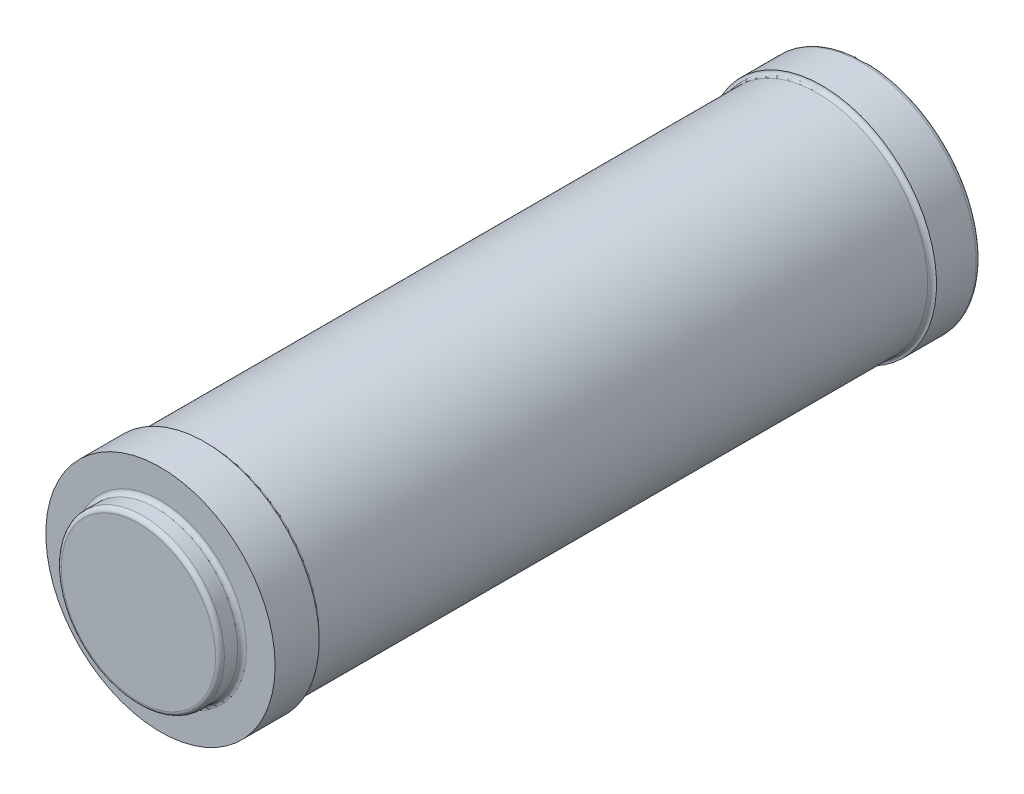
ISO-10303-21;
HEADER;
FILE_DESCRIPTION(('STEP AP214'),'2;1');
FILE_NAME('part.step','',(''),(''),'','','');
FILE_SCHEMA(('AUTOMOTIVE_DESIGN { 1 0 10303 214 1 1 1 1 }'));
ENDSEC;
DATA;
#1=APPLICATION_CONTEXT('core data for automotive mechanical design processes');
#2=APPLICATION_PROTOCOL_DEFINITION('international standard','automotive_design',2000,#1);
#3=PRODUCT_CONTEXT('',#1,'mechanical');
#4=PRODUCT('Part','Part','',(#3));
#5=PRODUCT_RELATED_PRODUCT_CATEGORY('part','',(#4));
#6=PRODUCT_DEFINITION_FORMATION('','',#4);
#7=PRODUCT_DEFINITION_CONTEXT('part definition',#1,'design');
#8=PRODUCT_DEFINITION('design','',#6,#7);
#9=PRODUCT_DEFINITION_SHAPE('','',#8);
#10=(LENGTH_UNIT() NAMED_UNIT(*) SI_UNIT(.MILLI.,.METRE.));
#11=(NAMED_UNIT(*) PLANE_ANGLE_UNIT() SI_UNIT($,.RADIAN.));
#12=(NAMED_UNIT(*) SI_UNIT($,.STERADIAN.) SOLID_ANGLE_UNIT());
#13=UNCERTAINTY_MEASURE_WITH_UNIT(LENGTH_MEASURE(1.E-05),#10,'distance_accuracy_value','');
#14=(GEOMETRIC_REPRESENTATION_CONTEXT(3) GLOBAL_UNCERTAINTY_ASSIGNED_CONTEXT((#13)) GLOBAL_UNIT_ASSIGNED_CONTEXT((#10,
#11,#12)) REPRESENTATION_CONTEXT('',''));
#15=CARTESIAN_POINT('',(0.,0.,0.));
#16=DIRECTION('',(0.,0.,1.));
#17=DIRECTION('',(1.,0.,0.));
#18=AXIS2_PLACEMENT_3D('',#15,#16,#17);
#19=CARTESIAN_POINT('',(-12.7458495625939,-1.53789816715388,30.));
#20=DIRECTION('',(0.,0.,-1.));
#21=DIRECTION('',(-1.,0.,0.));
#22=AXIS2_PLACEMENT_3D('',#19,#20,#21);
#23=CYLINDRICAL_SURFACE('',#22,5.);
#24=CARTESIAN_POINT('',(-12.7458495625939,-1.53789816715388,1.2));
#25=DIRECTION('',(0.,0.,-1.));
#26=DIRECTION('',(-1.,0.,0.));
#27=AXIS2_PLACEMENT_3D('',#24,#25,#26);
#28=CIRCLE('',#27,5.);
#29=CARTESIAN_POINT('',(-17.7458495625939,-1.53789816715388,1.2));
#30=VERTEX_POINT('',#29);
#31=EDGE_CURVE('E10',#30,#30,#28,.F.);
#32=ORIENTED_EDGE('',*,*,#31,.T.);
#33=EDGE_LOOP('',(#32));
#34=FACE_BOUND('',#33,.T.);
#35=CARTESIAN_POINT('',(-12.7458495625939,-1.53789816715388,28.8));
#36=DIRECTION('',(0.,0.,1.));
#37=DIRECTION('',(1.,0.,0.));
#38=AXIS2_PLACEMENT_3D('',#35,#36,#37);
#39=CIRCLE('',#38,5.);
#40=CARTESIAN_POINT('',(-7.74584956259395,-1.53789816715388,28.8));
#41=VERTEX_POINT('',#40);
#42=EDGE_CURVE('E49',#41,#41,#39,.F.);
#43=ORIENTED_EDGE('',*,*,#42,.T.);
#44=EDGE_LOOP('',(#43));
#45=FACE_BOUND('',#44,.T.);
#46=ADVANCED_FACE('F40',(#34,#45),#23,.T.);
#47=CARTESIAN_POINT('',(-12.7458495625939,-1.53789816715388,29.));
#48=DIRECTION('',(0.,0.,1.));
#49=DIRECTION('',(1.,0.,0.));
#50=AXIS2_PLACEMENT_3D('',#47,#48,#49);
#51=CYLINDRICAL_SURFACE('',#50,5.2);
#52=CARTESIAN_POINT('',(-12.7458495625939,-1.53789816715388,29.));
#53=DIRECTION('',(0.,0.,1.));
#54=DIRECTION('',(1.,0.,0.));
#55=AXIS2_PLACEMENT_3D('',#52,#53,#54);
#56=CIRCLE('',#55,5.2);
#57=CARTESIAN_POINT('',(-7.54584956259395,-1.53789816715388,29.));
#58=VERTEX_POINT('',#57);
#59=EDGE_CURVE('E89',#58,#58,#56,.T.);
#60=ORIENTED_EDGE('',*,*,#59,.T.);
#61=EDGE_LOOP('',(#60));
#62=FACE_BOUND('',#61,.T.);
#63=CARTESIAN_POINT('',(-12.7458495625939,-1.53789816715388,31.));
#64=DIRECTION('',(0.,0.,1.));
#65=DIRECTION('',(1.,0.,0.));
#66=AXIS2_PLACEMENT_3D('',#63,#64,#65);
#67=CIRCLE('',#66,5.2);
#68=CARTESIAN_POINT('',(-7.54584956259395,-1.53789816715388,31.));
#69=VERTEX_POINT('',#68);
#70=EDGE_CURVE('E93',#69,#69,#67,.T.);
#71=ORIENTED_EDGE('',*,*,#70,.F.);
#72=EDGE_LOOP('',(#71));
#73=FACE_BOUND('',#72,.T.);
#74=ADVANCED_FACE('F117',(#62,#73),#51,.T.);
#75=CARTESIAN_POINT('',(-12.7458495625939,-1.53789816715388,31.));
#76=DIRECTION('',(0.,0.,1.));
#77=DIRECTION('',(1.,0.,0.));
#78=AXIS2_PLACEMENT_3D('',#75,#76,#77);
#79=PLANE('',#78);
#80=CARTESIAN_POINT('',(-12.7458495625939,-1.53789816715388,31.));
#81=DIRECTION('',(0.,0.,1.));
#82=DIRECTION('',(1.,0.,0.));
#83=AXIS2_PLACEMENT_3D('',#80,#81,#82);
#84=CIRCLE('',#83,3.9);
#85=CARTESIAN_POINT('',(-8.84584956259395,-1.53789816715388,31.));
#86=VERTEX_POINT('',#85);
#87=EDGE_CURVE('E65',#86,#86,#84,.F.);
#88=ORIENTED_EDGE('',*,*,#87,.T.);
#89=EDGE_LOOP('',(#88));
#90=FACE_BOUND('',#89,.T.);
#91=ORIENTED_EDGE('',*,*,#70,.T.);
#92=EDGE_LOOP('',(#91));
#93=FACE_BOUND('',#92,.T.);
#94=ADVANCED_FACE('F122',(#90,#93),#79,.T.);
#95=CARTESIAN_POINT('',(-12.7458495625939,-1.53789816715388,32.));
#96=DIRECTION('',(0.,0.,-1.));
#97=DIRECTION('',(-1.,0.,0.));
#98=AXIS2_PLACEMENT_3D('',#95,#96,#97);
#99=CYLINDRICAL_SURFACE('',#98,3.7);
#100=CARTESIAN_POINT('',(-12.7458495625939,-1.53789816715388,31.8));
#101=DIRECTION('',(0.,0.,1.));
#102=DIRECTION('',(1.,0.,0.));
#103=AXIS2_PLACEMENT_3D('',#100,#101,#102);
#104=CIRCLE('',#103,3.7);
#105=CARTESIAN_POINT('',(-9.04584956259395,-1.53789816715388,31.8));
#106=VERTEX_POINT('',#105);
#107=EDGE_CURVE('E69',#106,#106,#104,.F.);
#108=ORIENTED_EDGE('',*,*,#107,.T.);
#109=EDGE_LOOP('',(#108));
#110=FACE_BOUND('',#109,.T.);
#111=CARTESIAN_POINT('',(-12.7458495625939,-1.53789816715388,31.2));
#112=DIRECTION('',(0.,0.,1.));
#113=DIRECTION('',(1.,0.,0.));
#114=AXIS2_PLACEMENT_3D('',#111,#112,#113);
#115=CIRCLE('',#114,3.7);
#116=CARTESIAN_POINT('',(-9.04584956259395,-1.53789816715388,31.2));
#117=VERTEX_POINT('',#116);
#118=EDGE_CURVE('E73',#117,#117,#115,.T.);
#119=ORIENTED_EDGE('',*,*,#118,.T.);
#120=EDGE_LOOP('',(#119));
#121=FACE_BOUND('',#120,.T.);
#122=ADVANCED_FACE('F141',(#110,#121),#99,.T.);
#123=CARTESIAN_POINT('',(-12.7458495625939,-1.53789816715388,32.));
#124=DIRECTION('',(0.,0.,1.));
#125=DIRECTION('',(1.,0.,0.));
#126=AXIS2_PLACEMENT_3D('',#123,#124,#125);
#127=PLANE('',#126);
#128=CARTESIAN_POINT('',(-12.7458495625939,-1.53789816715388,32.));
#129=DIRECTION('',(0.,0.,1.));
#130=DIRECTION('',(1.,0.,0.));
#131=AXIS2_PLACEMENT_3D('',#128,#129,#130);
#132=CIRCLE('',#131,3.5);
#133=CARTESIAN_POINT('',(-9.24584956259395,-1.53789816715388,32.));
#134=VERTEX_POINT('',#133);
#135=EDGE_CURVE('E77',#134,#134,#132,.T.);
#136=ORIENTED_EDGE('',*,*,#135,.T.);
#137=EDGE_LOOP('',(#136));
#138=FACE_BOUND('',#137,.T.);
#139=ADVANCED_FACE('F143',(#138),#127,.T.);
#140=CARTESIAN_POINT('',(-12.7458495625939,-1.53789816715388,1.));
#141=DIRECTION('',(0.,0.,-1.));
#142=DIRECTION('',(-1.,0.,0.));
#143=AXIS2_PLACEMENT_3D('',#140,#141,#142);
#144=CYLINDRICAL_SURFACE('',#143,5.2);
#145=CARTESIAN_POINT('',(-12.7458495625939,-1.53789816715388,-0.8));
#146=DIRECTION('',(0.,0.,-1.));
#147=DIRECTION('',(-1.,0.,0.));
#148=AXIS2_PLACEMENT_3D('',#145,#146,#147);
#149=CIRCLE('',#148,5.2);
#150=CARTESIAN_POINT('',(-17.9458495625939,-1.53789816715388,-0.8));
#151=VERTEX_POINT('',#150);
#152=EDGE_CURVE('E54',#151,#151,#149,.F.);
#153=ORIENTED_EDGE('',*,*,#152,.T.);
#154=EDGE_LOOP('',(#153));
#155=FACE_BOUND('',#154,.T.);
#156=CARTESIAN_POINT('',(-12.7458495625939,-1.53789816715388,1.));
#157=DIRECTION('',(0.,0.,-1.));
#158=DIRECTION('',(-1.,0.,0.));
#159=AXIS2_PLACEMENT_3D('',#156,#157,#158);
#160=CIRCLE('',#159,5.2);
#161=CARTESIAN_POINT('',(-17.9458495625939,-1.53789816715388,1.));
#162=VERTEX_POINT('',#161);
#163=EDGE_CURVE('E97',#162,#162,#160,.T.);
#164=ORIENTED_EDGE('',*,*,#163,.T.);
#165=EDGE_LOOP('',(#164));
#166=FACE_BOUND('',#165,.T.);
#167=ADVANCED_FACE('F102',(#155,#166),#144,.T.);
#168=CARTESIAN_POINT('',(-12.7458495625939,-1.53789816715388,-1.));
#169=DIRECTION('',(0.,0.,-1.));
#170=DIRECTION('',(-1.,0.,0.));
#171=AXIS2_PLACEMENT_3D('',#168,#169,#170);
#172=PLANE('',#171);
#173=CARTESIAN_POINT('',(-12.7458495625939,-1.53789816715388,-1.));
#174=DIRECTION('',(0.,0.,-1.));
#175=DIRECTION('',(-1.,0.,0.));
#176=AXIS2_PLACEMENT_3D('',#173,#174,#175);
#177=CIRCLE('',#176,5.);
#178=CARTESIAN_POINT('',(-17.7458495625939,-1.53789816715388,-1.));
#179=VERTEX_POINT('',#178);
#180=EDGE_CURVE('E59',#179,#179,#177,.T.);
#181=ORIENTED_EDGE('',*,*,#180,.T.);
#182=EDGE_LOOP('',(#181));
#183=FACE_BOUND('',#182,.T.);
#184=ADVANCED_FACE('F131',(#183),#172,.T.);
#185=CARTESIAN_POINT('',(-12.7458495625939,-1.53789816715388,31.8));
#186=DIRECTION('',(0.,0.,1.));
#187=DIRECTION('',(1.,0.,0.));
#188=AXIS2_PLACEMENT_3D('',#185,#186,#187);
#189=TOROIDAL_SURFACE('',#188,3.5,0.2);
#190=ORIENTED_EDGE('',*,*,#107,.F.);
#191=EDGE_LOOP('',(#190));
#192=FACE_BOUND('',#191,.T.);
#193=ORIENTED_EDGE('',*,*,#135,.F.);
#194=EDGE_LOOP('',(#193));
#195=FACE_BOUND('',#194,.T.);
#196=ADVANCED_FACE('F128',(#192,#195),#189,.T.);
#197=CARTESIAN_POINT('',(-12.7458495625939,-1.53789816715388,31.2));
#198=DIRECTION('',(0.,0.,1.));
#199=DIRECTION('',(1.,0.,0.));
#200=AXIS2_PLACEMENT_3D('',#197,#198,#199);
#201=TOROIDAL_SURFACE('',#200,3.9,0.2);
#202=ORIENTED_EDGE('',*,*,#87,.F.);
#203=EDGE_LOOP('',(#202));
#204=FACE_BOUND('',#203,.T.);
#205=ORIENTED_EDGE('',*,*,#118,.F.);
#206=EDGE_LOOP('',(#205));
#207=FACE_BOUND('',#206,.T.);
#208=ADVANCED_FACE('F113',(#204,#207),#201,.F.);
#209=CARTESIAN_POINT('',(-12.7458495625939,-1.53789816715388,-0.8));
#210=DIRECTION('',(0.,0.,-1.));
#211=DIRECTION('',(-1.,0.,0.));
#212=AXIS2_PLACEMENT_3D('',#209,#210,#211);
#213=TOROIDAL_SURFACE('',#212,5.,0.2);
#214=ORIENTED_EDGE('',*,*,#152,.F.);
#215=EDGE_LOOP('',(#214));
#216=FACE_BOUND('',#215,.T.);
#217=ORIENTED_EDGE('',*,*,#180,.F.);
#218=EDGE_LOOP('',(#217));
#219=FACE_BOUND('',#218,.T.);
#220=ADVANCED_FACE('F106',(#216,#219),#213,.T.);
#221=CARTESIAN_POINT('',(-12.7458495625939,-1.53789816715388,1.2));
#222=DIRECTION('',(0.,0.,-1.));
#223=DIRECTION('',(-1.,0.,0.));
#224=AXIS2_PLACEMENT_3D('',#221,#222,#223);
#225=TOROIDAL_SURFACE('',#224,5.2,0.2);
#226=ORIENTED_EDGE('',*,*,#31,.F.);
#227=EDGE_LOOP('',(#226));
#228=FACE_BOUND('',#227,.T.);
#229=ORIENTED_EDGE('',*,*,#163,.F.);
#230=EDGE_LOOP('',(#229));
#231=FACE_BOUND('',#230,.T.);
#232=ADVANCED_FACE('F104',(#228,#231),#225,.F.);
#233=CARTESIAN_POINT('',(-12.7458495625939,-1.53789816715388,28.8));
#234=DIRECTION('',(0.,0.,1.));
#235=DIRECTION('',(1.,0.,0.));
#236=AXIS2_PLACEMENT_3D('',#233,#234,#235);
#237=TOROIDAL_SURFACE('',#236,5.2,0.2);
#238=ORIENTED_EDGE('',*,*,#42,.F.);
#239=EDGE_LOOP('',(#238));
#240=FACE_BOUND('',#239,.T.);
#241=ORIENTED_EDGE('',*,*,#59,.F.);
#242=EDGE_LOOP('',(#241));
#243=FACE_BOUND('',#242,.T.);
#244=ADVANCED_FACE('F42',(#240,#243),#237,.F.);
#245=CLOSED_SHELL('',(#46,#74,#94,#122,#139,#167,#184,#196,#208,#220,#232,#244));
#246=CARTESIAN_POINT('',(-12.7458495625939,-1.53789816715388,1.));
#247=DIRECTION('',(0.,0.,-1.));
#248=DIRECTION('',(-1.,0.,0.));
#249=AXIS2_PLACEMENT_3D('',#246,#247,#248);
#250=PLANE('',#249);
#251=CARTESIAN_POINT('',(-12.7458495625939,-1.53789816715388,1.));
#252=DIRECTION('',(0.,0.,-1.));
#253=DIRECTION('',(-1.,0.,0.));
#254=AXIS2_PLACEMENT_3D('',#251,#252,#253);
#255=CIRCLE('',#254,4.8);
#256=CARTESIAN_POINT('',(-17.5458495625939,-1.53789816715388,1.));
#257=VERTEX_POINT('',#256);
#258=EDGE_CURVE('E81',#257,#257,#255,.F.);
#259=ORIENTED_EDGE('',*,*,#258,.T.);
#260=EDGE_LOOP('',(#259));
#261=FACE_BOUND('',#260,.T.);
#262=ADVANCED_FACE('F158',(#261),#250,.F.);
#263=CARTESIAN_POINT('',(-12.7458495625939,-1.53789816715388,29.));
#264=DIRECTION('',(0.,0.,1.));
#265=DIRECTION('',(1.,0.,0.));
#266=AXIS2_PLACEMENT_3D('',#263,#264,#265);
#267=PLANE('',#266);
#268=CARTESIAN_POINT('',(-12.7458495625939,-1.53789816715388,29.));
#269=DIRECTION('',(0.,0.,1.));
#270=DIRECTION('',(1.,0.,0.));
#271=AXIS2_PLACEMENT_3D('',#268,#269,#270);
#272=CIRCLE('',#271,4.8);
#273=CARTESIAN_POINT('',(-7.94584956259395,-1.53789816715388,29.));
#274=VERTEX_POINT('',#273);
#275=EDGE_CURVE('E85',#274,#274,#272,.F.);
#276=ORIENTED_EDGE('',*,*,#275,.T.);
#277=EDGE_LOOP('',(#276));
#278=FACE_BOUND('',#277,.T.);
#279=ADVANCED_FACE('F156',(#278),#267,.F.);
#280=CARTESIAN_POINT('',(-12.7458495625939,-1.53789816715388,0.));
#281=DIRECTION('',(0.,0.,1.));
#282=DIRECTION('',(1.,0.,0.));
#283=AXIS2_PLACEMENT_3D('',#280,#281,#282);
#284=CYLINDRICAL_SURFACE('',#283,4.8);
#285=ORIENTED_EDGE('',*,*,#275,.F.);
#286=EDGE_LOOP('',(#285));
#287=FACE_BOUND('',#286,.T.);
#288=ORIENTED_EDGE('',*,*,#258,.F.);
#289=EDGE_LOOP('',(#288));
#290=FACE_BOUND('',#289,.T.);
#291=ADVANCED_FACE('F127',(#287,#290),#284,.F.);
#292=CLOSED_SHELL('',(#262,#279,#291));
#293=ORIENTED_CLOSED_SHELL('',*,#292,.T.);
#294=BREP_WITH_VOIDS('B2',#245,(#293));
#295=ADVANCED_BREP_SHAPE_REPRESENTATION('',(#18,#294),#14);
#296=SHAPE_DEFINITION_REPRESENTATION(#9,#295);
ENDSEC;
END-ISO-10303-21;
